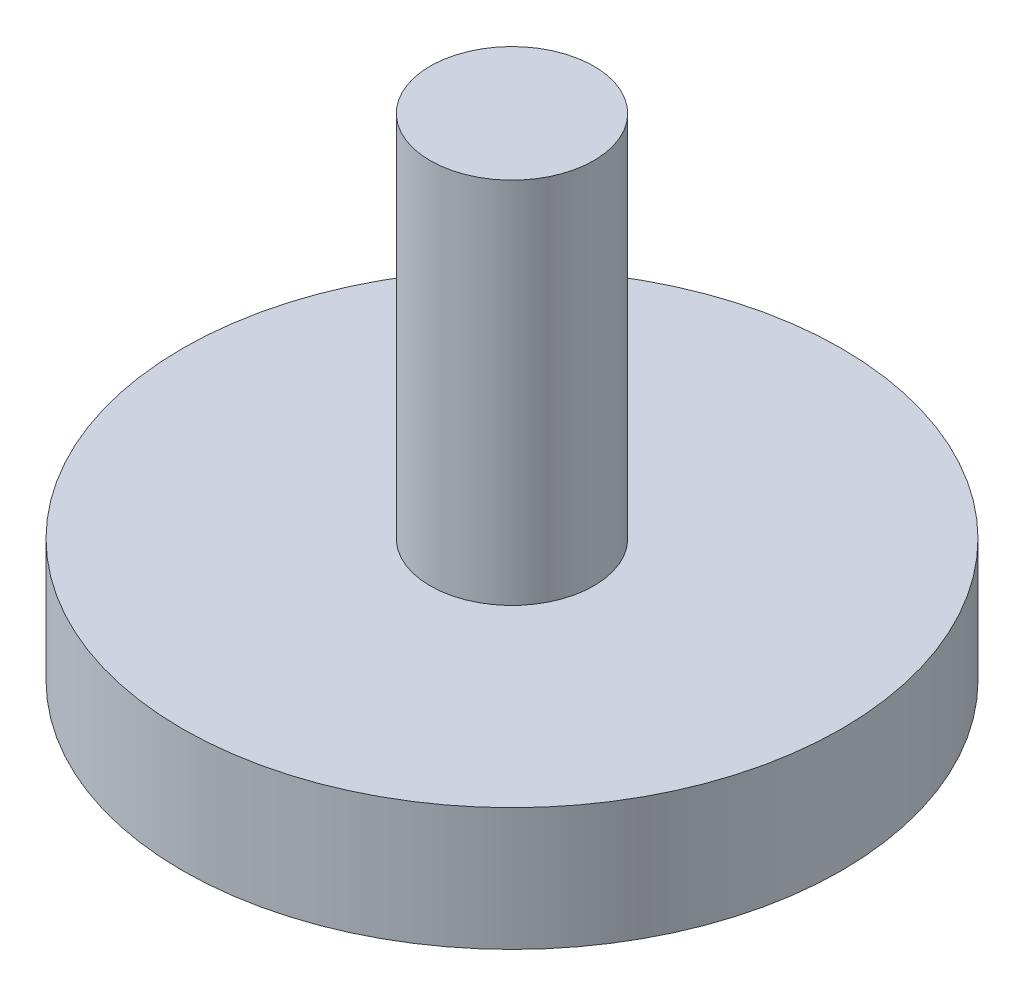
ISO-10303-21;
HEADER;
FILE_DESCRIPTION(('STEP AP214'),'2;1');
FILE_NAME('part.step','',(''),(''),'','','');
FILE_SCHEMA(('AUTOMOTIVE_DESIGN { 1 0 10303 214 1 1 1 1 }'));
ENDSEC;
DATA;
#1=APPLICATION_CONTEXT('core data for automotive mechanical design processes');
#2=APPLICATION_PROTOCOL_DEFINITION('international standard','automotive_design',2000,#1);
#3=PRODUCT_CONTEXT('',#1,'mechanical');
#4=PRODUCT('Part','Part','',(#3));
#5=PRODUCT_RELATED_PRODUCT_CATEGORY('part','',(#4));
#6=PRODUCT_DEFINITION_FORMATION('','',#4);
#7=PRODUCT_DEFINITION_CONTEXT('part definition',#1,'design');
#8=PRODUCT_DEFINITION('design','',#6,#7);
#9=PRODUCT_DEFINITION_SHAPE('','',#8);
#10=(LENGTH_UNIT() NAMED_UNIT(*) SI_UNIT(.MILLI.,.METRE.));
#11=(NAMED_UNIT(*) PLANE_ANGLE_UNIT() SI_UNIT($,.RADIAN.));
#12=(NAMED_UNIT(*) SI_UNIT($,.STERADIAN.) SOLID_ANGLE_UNIT());
#13=UNCERTAINTY_MEASURE_WITH_UNIT(LENGTH_MEASURE(1.E-05),#10,'distance_accuracy_value','');
#14=(GEOMETRIC_REPRESENTATION_CONTEXT(3) GLOBAL_UNCERTAINTY_ASSIGNED_CONTEXT((#13)) GLOBAL_UNIT_ASSIGNED_CONTEXT((#10,
#11,#12)) REPRESENTATION_CONTEXT('',''));
#15=CARTESIAN_POINT('',(0.,0.,0.));
#16=DIRECTION('',(0.,0.,1.));
#17=DIRECTION('',(1.,0.,0.));
#18=AXIS2_PLACEMENT_3D('',#15,#16,#17);
#19=CARTESIAN_POINT('',(0.,9.525,0.));
#20=DIRECTION('',(0.,-1.,0.));
#21=DIRECTION('',(0.,0.,-1.));
#22=AXIS2_PLACEMENT_3D('',#19,#20,#21);
#23=CYLINDRICAL_SURFACE('',#22,51.1302);
#24=CARTESIAN_POINT('',(0.,9.525,0.));
#25=DIRECTION('',(0.,1.,0.));
#26=DIRECTION('',(0.,0.,1.));
#27=AXIS2_PLACEMENT_3D('',#24,#25,#26);
#28=CIRCLE('',#27,51.1302);
#29=CARTESIAN_POINT('',(0.,9.525,-51.1302));
#30=VERTEX_POINT('',#29);
#31=EDGE_CURVE('E49',#30,#30,#28,.T.);
#32=CARTESIAN_POINT('',(0.,-9.525,0.));
#33=DIRECTION('',(0.,1.,0.));
#34=DIRECTION('',(0.,0.,1.));
#35=AXIS2_PLACEMENT_3D('',#32,#33,#34);
#36=CIRCLE('',#35,51.1302);
#37=CARTESIAN_POINT('',(0.,-9.525,-51.1302));
#38=VERTEX_POINT('',#37);
#39=EDGE_CURVE('E44',#38,#38,#36,.T.);
#40=CARTESIAN_POINT('',(0.,9.525,-51.1302));
#41=CARTESIAN_POINT('',(0.,9.3265625,-51.1302));
#42=CARTESIAN_POINT('',(0.,9.128125,-51.1302));
#43=CARTESIAN_POINT('',(0.,8.73125,-51.1302));
#44=CARTESIAN_POINT('',(0.,8.5328125,-51.1302));
#45=CARTESIAN_POINT('',(0.,8.1359375,-51.1302));
#46=CARTESIAN_POINT('',(0.,7.9375,-51.1302));
#47=CARTESIAN_POINT('',(0.,7.540625,-51.1302));
#48=CARTESIAN_POINT('',(0.,7.3421875,-51.1302));
#49=CARTESIAN_POINT('',(0.,6.9453125,-51.1302));
#50=CARTESIAN_POINT('',(0.,6.746875,-51.1302));
#51=CARTESIAN_POINT('',(0.,6.35,-51.1302));
#52=CARTESIAN_POINT('',(0.,6.1515625,-51.1302));
#53=CARTESIAN_POINT('',(0.,5.7546875,-51.1302));
#54=CARTESIAN_POINT('',(0.,5.55625,-51.1302));
#55=CARTESIAN_POINT('',(0.,5.159375,-51.1302));
#56=CARTESIAN_POINT('',(0.,4.9609375,-51.1302));
#57=CARTESIAN_POINT('',(0.,4.5640625,-51.1302));
#58=CARTESIAN_POINT('',(0.,4.365625,-51.1302));
#59=CARTESIAN_POINT('',(0.,3.96875,-51.1302));
#60=CARTESIAN_POINT('',(0.,3.7703125,-51.1302));
#61=CARTESIAN_POINT('',(0.,3.3734375,-51.1302));
#62=CARTESIAN_POINT('',(0.,3.175,-51.1302));
#63=CARTESIAN_POINT('',(0.,2.778125,-51.1302));
#64=CARTESIAN_POINT('',(0.,2.5796875,-51.1302));
#65=CARTESIAN_POINT('',(0.,2.1828125,-51.1302));
#66=CARTESIAN_POINT('',(0.,1.984375,-51.1302));
#67=CARTESIAN_POINT('',(0.,1.5875,-51.1302));
#68=CARTESIAN_POINT('',(0.,1.3890625,-51.1302));
#69=CARTESIAN_POINT('',(0.,0.992187499999999,-51.1302));
#70=CARTESIAN_POINT('',(0.,0.793749999999999,-51.1302));
#71=CARTESIAN_POINT('',(0.,0.396874999999998,-51.1302));
#72=CARTESIAN_POINT('',(0.,0.198437499999998,-51.1302));
#73=CARTESIAN_POINT('',(0.,-0.198437500000002,-51.1302));
#74=CARTESIAN_POINT('',(0.,-0.396875000000002,-51.1302));
#75=CARTESIAN_POINT('',(0.,-0.793750000000002,-51.1302));
#76=CARTESIAN_POINT('',(0.,-0.992187500000002,-51.1302));
#77=CARTESIAN_POINT('',(0.,-1.3890625,-51.1302));
#78=CARTESIAN_POINT('',(0.,-1.5875,-51.1302));
#79=CARTESIAN_POINT('',(0.,-1.984375,-51.1302));
#80=CARTESIAN_POINT('',(0.,-2.1828125,-51.1302));
#81=CARTESIAN_POINT('',(0.,-2.5796875,-51.1302));
#82=CARTESIAN_POINT('',(0.,-2.778125,-51.1302));
#83=CARTESIAN_POINT('',(0.,-3.175,-51.1302));
#84=CARTESIAN_POINT('',(0.,-3.3734375,-51.1302));
#85=CARTESIAN_POINT('',(0.,-3.7703125,-51.1302));
#86=CARTESIAN_POINT('',(0.,-3.96875,-51.1302));
#87=CARTESIAN_POINT('',(0.,-4.365625,-51.1302));
#88=CARTESIAN_POINT('',(0.,-4.5640625,-51.1302));
#89=CARTESIAN_POINT('',(0.,-4.9609375,-51.1302));
#90=CARTESIAN_POINT('',(0.,-5.159375,-51.1302));
#91=CARTESIAN_POINT('',(0.,-5.55625,-51.1302));
#92=CARTESIAN_POINT('',(0.,-5.7546875,-51.1302));
#93=CARTESIAN_POINT('',(0.,-6.1515625,-51.1302));
#94=CARTESIAN_POINT('',(0.,-6.35,-51.1302));
#95=CARTESIAN_POINT('',(0.,-6.746875,-51.1302));
#96=CARTESIAN_POINT('',(0.,-6.9453125,-51.1302));
#97=CARTESIAN_POINT('',(0.,-7.3421875,-51.1302));
#98=CARTESIAN_POINT('',(0.,-7.540625,-51.1302));
#99=CARTESIAN_POINT('',(0.,-7.9375,-51.1302));
#100=CARTESIAN_POINT('',(0.,-8.1359375,-51.1302));
#101=CARTESIAN_POINT('',(0.,-8.5328125,-51.1302));
#102=CARTESIAN_POINT('',(0.,-8.73125,-51.1302));
#103=CARTESIAN_POINT('',(0.,-9.128125,-51.1302));
#104=CARTESIAN_POINT('',(0.,-9.3265625,-51.1302));
#105=CARTESIAN_POINT('',(0.,-9.525,-51.1302));
#106=B_SPLINE_CURVE_WITH_KNOTS('',3,(#40,#41,#42,#43,#44,#45,#46,#47,#48,#49,#50,#51,#52,#53,
#54,#55,#56,#57,#58,#59,#60,#61,#62,#63,#64,#65,#66,#67,#68,#69,#70,#71,#72,#73,#74,#75,#76,#77,
#78,#79,#80,#81,#82,#83,#84,#85,#86,#87,#88,#89,#90,#91,#92,#93,#94,#95,#96,#97,#98,#99,#100,
#101,#102,#103,#104,#105),.UNSPECIFIED.,.F.,.F.,(4,2,2,2,2,2,2,2,2,2,2,2,2,2,2,2,2,2,2,2,2,2,2,
2,2,2,2,2,2,2,2,2,4),(0.,0.595312499999999,1.190625,1.7859375,2.38125,2.9765625,3.571875,
4.1671875,4.7625,5.3578125,5.953125,6.5484375,7.14375,7.7390625,8.334375,8.9296875,9.525,
10.1203125,10.715625,11.3109375,11.90625,12.5015625,13.096875,13.6921875,14.2875,14.8828125,
15.478125,16.0734375,16.66875,17.2640625,17.859375,18.4546875,19.05),.UNSPECIFIED.);
#107=EDGE_CURVE('BSEAM41',#30,#38,#106,.T.);
#108=ORIENTED_EDGE('',*,*,#31,.F.);
#109=ORIENTED_EDGE('',*,*,#39,.T.);
#110=ORIENTED_EDGE('',*,*,#107,.T.);
#111=ORIENTED_EDGE('',*,*,#107,.F.);
#112=EDGE_LOOP('',(#108,#110,#109,#111));
#113=FACE_BOUND('',#112,.T.);
#114=ADVANCED_FACE('F41',(#113),#23,.T.);
#115=CARTESIAN_POINT('',(0.,9.525,0.));
#116=DIRECTION('',(0.,1.,0.));
#117=DIRECTION('',(0.,0.,1.));
#118=AXIS2_PLACEMENT_3D('',#115,#116,#117);
#119=PLANE('',#118);
#120=CARTESIAN_POINT('',(0.,9.525,0.));
#121=DIRECTION('',(0.,1.,0.));
#122=DIRECTION('',(0.,0.,1.));
#123=AXIS2_PLACEMENT_3D('',#120,#121,#122);
#124=CIRCLE('',#123,12.7);
#125=CARTESIAN_POINT('',(0.,9.525,12.7));
#126=VERTEX_POINT('',#125);
#127=EDGE_CURVE('E10',#126,#126,#124,.T.);
#128=ORIENTED_EDGE('',*,*,#127,.F.);
#129=EDGE_LOOP('',(#128));
#130=FACE_BOUND('',#129,.T.);
#131=ORIENTED_EDGE('',*,*,#31,.T.);
#132=EDGE_LOOP('',(#131));
#133=FACE_BOUND('',#132,.T.);
#134=ADVANCED_FACE('F69',(#130,#133),#119,.T.);
#135=CARTESIAN_POINT('',(0.,-9.525,0.));
#136=DIRECTION('',(0.,1.,0.));
#137=DIRECTION('',(0.,0.,1.));
#138=AXIS2_PLACEMENT_3D('',#135,#136,#137);
#139=PLANE('',#138);
#140=ORIENTED_EDGE('',*,*,#39,.F.);
#141=EDGE_LOOP('',(#140));
#142=FACE_BOUND('',#141,.T.);
#143=ADVANCED_FACE('F66',(#142),#139,.F.);
#144=CARTESIAN_POINT('',(0.,66.675,0.));
#145=DIRECTION('',(0.,-1.,0.));
#146=DIRECTION('',(0.,0.,-1.));
#147=AXIS2_PLACEMENT_3D('',#144,#145,#146);
#148=CYLINDRICAL_SURFACE('',#147,12.7);
#149=CARTESIAN_POINT('',(0.,66.675,0.));
#150=DIRECTION('',(0.,1.,0.));
#151=DIRECTION('',(0.,0.,1.));
#152=AXIS2_PLACEMENT_3D('',#149,#150,#151);
#153=CIRCLE('',#152,12.7);
#154=CARTESIAN_POINT('',(0.,66.675,12.7));
#155=VERTEX_POINT('',#154);
#156=EDGE_CURVE('E56',#155,#155,#153,.T.);
#157=ORIENTED_EDGE('',*,*,#156,.F.);
#158=EDGE_LOOP('',(#157));
#159=FACE_BOUND('',#158,.T.);
#160=ORIENTED_EDGE('',*,*,#127,.T.);
#161=EDGE_LOOP('',(#160));
#162=FACE_BOUND('',#161,.T.);
#163=ADVANCED_FACE('F68',(#159,#162),#148,.T.);
#164=CARTESIAN_POINT('',(0.,66.675,0.));
#165=DIRECTION('',(0.,1.,0.));
#166=DIRECTION('',(0.,0.,1.));
#167=AXIS2_PLACEMENT_3D('',#164,#165,#166);
#168=PLANE('',#167);
#169=ORIENTED_EDGE('',*,*,#156,.T.);
#170=EDGE_LOOP('',(#169));
#171=FACE_BOUND('',#170,.T.);
#172=ADVANCED_FACE('F74',(#171),#168,.T.);
#173=CLOSED_SHELL('',(#114,#134,#143,#163,#172));
#174=MANIFOLD_SOLID_BREP('B2',#173);
#175=ADVANCED_BREP_SHAPE_REPRESENTATION('',(#18,#174),#14);
#176=SHAPE_DEFINITION_REPRESENTATION(#9,#175);
ENDSEC;
END-ISO-10303-21;
